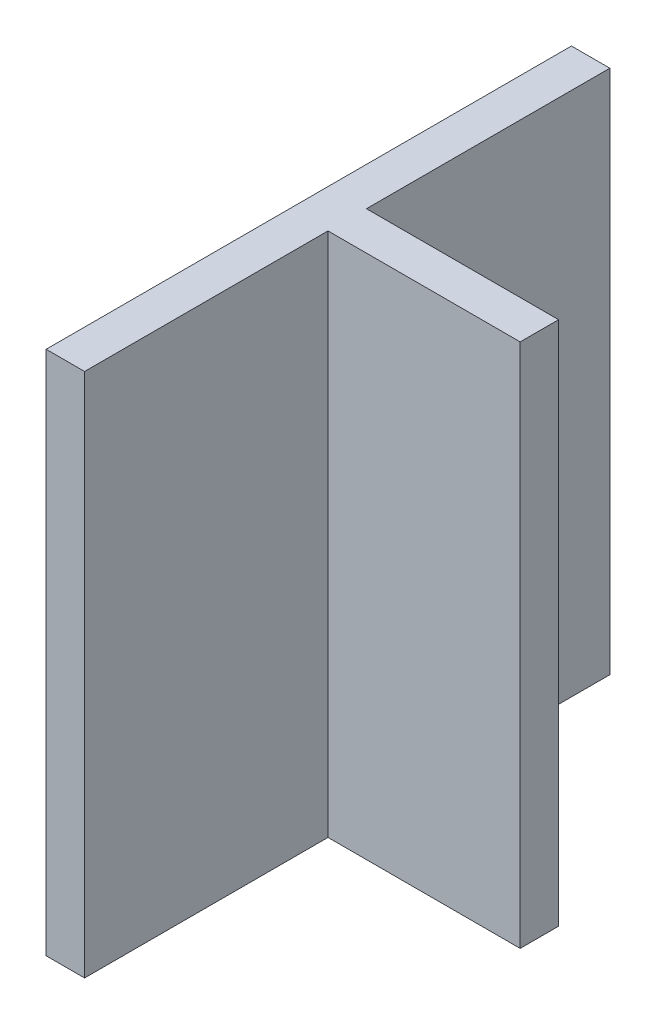
ISO-10303-21;
HEADER;
FILE_DESCRIPTION(('STEP AP214'),'2;1');
FILE_NAME('part.step','',(''),(''),'','','');
FILE_SCHEMA(('AUTOMOTIVE_DESIGN { 1 0 10303 214 1 1 1 1 }'));
ENDSEC;
DATA;
#1=APPLICATION_CONTEXT('core data for automotive mechanical design processes');
#2=APPLICATION_PROTOCOL_DEFINITION('international standard','automotive_design',2000,#1);
#3=PRODUCT_CONTEXT('',#1,'mechanical');
#4=PRODUCT('Part','Part','',(#3));
#5=PRODUCT_RELATED_PRODUCT_CATEGORY('part','',(#4));
#6=PRODUCT_DEFINITION_FORMATION('','',#4);
#7=PRODUCT_DEFINITION_CONTEXT('part definition',#1,'design');
#8=PRODUCT_DEFINITION('design','',#6,#7);
#9=PRODUCT_DEFINITION_SHAPE('','',#8);
#10=(LENGTH_UNIT() NAMED_UNIT(*) SI_UNIT(.MILLI.,.METRE.));
#11=(NAMED_UNIT(*) PLANE_ANGLE_UNIT() SI_UNIT($,.RADIAN.));
#12=(NAMED_UNIT(*) SI_UNIT($,.STERADIAN.) SOLID_ANGLE_UNIT());
#13=UNCERTAINTY_MEASURE_WITH_UNIT(LENGTH_MEASURE(1.E-05),#10,'distance_accuracy_value','');
#14=(GEOMETRIC_REPRESENTATION_CONTEXT(3) GLOBAL_UNCERTAINTY_ASSIGNED_CONTEXT((#13)) GLOBAL_UNIT_ASSIGNED_CONTEXT((#10,
#11,#12)) REPRESENTATION_CONTEXT('',''));
#15=CARTESIAN_POINT('',(0.,0.,0.));
#16=DIRECTION('',(0.,0.,1.));
#17=DIRECTION('',(1.,0.,0.));
#18=AXIS2_PLACEMENT_3D('',#15,#16,#17);
#19=CARTESIAN_POINT('',(0.,41.,-20.5));
#20=DIRECTION('',(1.,0.,0.));
#21=DIRECTION('',(0.,0.,-1.));
#22=AXIS2_PLACEMENT_3D('',#19,#20,#21);
#23=PLANE('',#22);
#24=DIRECTION('',(0.,0.,1.));
#25=VECTOR('',#24,1.);
#26=CARTESIAN_POINT('',(0.,0.,-20.5));
#27=LINE('',#26,#25);
#28=CARTESIAN_POINT('',(0.,0.,-20.5));
#29=VERTEX_POINT('',#28);
#30=CARTESIAN_POINT('',(0.,0.,20.5));
#31=VERTEX_POINT('',#30);
#32=EDGE_CURVE('E140',#29,#31,#27,.T.);
#33=ORIENTED_EDGE('',*,*,#32,.T.);
#34=DIRECTION('',(0.,-1.,0.));
#35=VECTOR('',#34,1.);
#36=CARTESIAN_POINT('',(0.,41.,20.5));
#37=LINE('',#36,#35);
#38=CARTESIAN_POINT('',(0.,41.,20.5));
#39=VERTEX_POINT('',#38);
#40=EDGE_CURVE('E11',#39,#31,#37,.T.);
#41=ORIENTED_EDGE('',*,*,#40,.F.);
#42=DIRECTION('',(0.,0.,1.));
#43=VECTOR('',#42,1.);
#44=CARTESIAN_POINT('',(0.,41.,-20.5));
#45=LINE('',#44,#43);
#46=CARTESIAN_POINT('',(0.,41.,-20.5));
#47=VERTEX_POINT('',#46);
#48=EDGE_CURVE('E162',#47,#39,#45,.T.);
#49=ORIENTED_EDGE('',*,*,#48,.F.);
#50=DIRECTION('',(0.,-1.,0.));
#51=VECTOR('',#50,1.);
#52=CARTESIAN_POINT('',(0.,41.,-20.5));
#53=LINE('',#52,#51);
#54=EDGE_CURVE('E136',#47,#29,#53,.T.);
#55=ORIENTED_EDGE('',*,*,#54,.T.);
#56=EDGE_LOOP('',(#33,#41,#49,#55));
#57=FACE_BOUND('',#56,.T.);
#58=ADVANCED_FACE('F39',(#57),#23,.F.);
#59=CARTESIAN_POINT('',(3.,41.,20.5));
#60=DIRECTION('',(0.,0.,-1.));
#61=DIRECTION('',(-1.,0.,0.));
#62=AXIS2_PLACEMENT_3D('',#59,#60,#61);
#63=PLANE('',#62);
#64=DIRECTION('',(1.,0.,0.));
#65=VECTOR('',#64,1.);
#66=CARTESIAN_POINT('',(3.,0.,20.5));
#67=LINE('',#66,#65);
#68=CARTESIAN_POINT('',(3.,0.,20.5));
#69=VERTEX_POINT('',#68);
#70=EDGE_CURVE('E144',#31,#69,#67,.T.);
#71=ORIENTED_EDGE('',*,*,#70,.T.);
#72=DIRECTION('',(0.,-1.,0.));
#73=VECTOR('',#72,1.);
#74=CARTESIAN_POINT('',(3.,41.,20.5));
#75=LINE('',#74,#73);
#76=CARTESIAN_POINT('',(3.,41.,20.5));
#77=VERTEX_POINT('',#76);
#78=EDGE_CURVE('E48',#77,#69,#75,.T.);
#79=ORIENTED_EDGE('',*,*,#78,.F.);
#80=DIRECTION('',(1.,0.,0.));
#81=VECTOR('',#80,1.);
#82=CARTESIAN_POINT('',(3.,41.,20.5));
#83=LINE('',#82,#81);
#84=EDGE_CURVE('E99',#39,#77,#83,.T.);
#85=ORIENTED_EDGE('',*,*,#84,.F.);
#86=ORIENTED_EDGE('',*,*,#40,.T.);
#87=EDGE_LOOP('',(#71,#79,#85,#86));
#88=FACE_BOUND('',#87,.T.);
#89=ADVANCED_FACE('F208',(#88),#63,.F.);
#90=CARTESIAN_POINT('',(3.,41.,1.5));
#91=DIRECTION('',(-1.,0.,0.));
#92=DIRECTION('',(0.,0.,1.));
#93=AXIS2_PLACEMENT_3D('',#90,#91,#92);
#94=PLANE('',#93);
#95=DIRECTION('',(0.,0.,-1.));
#96=VECTOR('',#95,1.);
#97=CARTESIAN_POINT('',(3.,0.,1.5));
#98=LINE('',#97,#96);
#99=CARTESIAN_POINT('',(3.,0.,1.5));
#100=VERTEX_POINT('',#99);
#101=EDGE_CURVE('E147',#69,#100,#98,.T.);
#102=ORIENTED_EDGE('',*,*,#101,.T.);
#103=DIRECTION('',(0.,-1.,0.));
#104=VECTOR('',#103,1.);
#105=CARTESIAN_POINT('',(3.,41.,1.5));
#106=LINE('',#105,#104);
#107=CARTESIAN_POINT('',(3.,41.,1.5));
#108=VERTEX_POINT('',#107);
#109=EDGE_CURVE('E173',#108,#100,#106,.T.);
#110=ORIENTED_EDGE('',*,*,#109,.F.);
#111=DIRECTION('',(0.,0.,-1.));
#112=VECTOR('',#111,1.);
#113=CARTESIAN_POINT('',(3.,41.,1.5));
#114=LINE('',#113,#112);
#115=EDGE_CURVE('E183',#77,#108,#114,.T.);
#116=ORIENTED_EDGE('',*,*,#115,.F.);
#117=ORIENTED_EDGE('',*,*,#78,.T.);
#118=EDGE_LOOP('',(#102,#110,#116,#117));
#119=FACE_BOUND('',#118,.T.);
#120=ADVANCED_FACE('F181',(#119),#94,.F.);
#121=CARTESIAN_POINT('',(18.,41.,1.49999999999999));
#122=DIRECTION('',(0.,0.,-1.));
#123=DIRECTION('',(-1.,0.,0.));
#124=AXIS2_PLACEMENT_3D('',#121,#122,#123);
#125=PLANE('',#124);
#126=DIRECTION('',(1.,0.,0.));
#127=VECTOR('',#126,1.);
#128=CARTESIAN_POINT('',(18.,0.,1.49999999999999));
#129=LINE('',#128,#127);
#130=CARTESIAN_POINT('',(18.,0.,1.49999999999999));
#131=VERTEX_POINT('',#130);
#132=EDGE_CURVE('E150',#100,#131,#129,.T.);
#133=ORIENTED_EDGE('',*,*,#132,.T.);
#134=DIRECTION('',(0.,-1.,0.));
#135=VECTOR('',#134,1.);
#136=CARTESIAN_POINT('',(18.,41.,1.49999999999999));
#137=LINE('',#136,#135);
#138=CARTESIAN_POINT('',(18.,41.,1.49999999999999));
#139=VERTEX_POINT('',#138);
#140=EDGE_CURVE('E169',#139,#131,#137,.T.);
#141=ORIENTED_EDGE('',*,*,#140,.F.);
#142=DIRECTION('',(1.,0.,0.));
#143=VECTOR('',#142,1.);
#144=CARTESIAN_POINT('',(18.,41.,1.49999999999999));
#145=LINE('',#144,#143);
#146=EDGE_CURVE('E196',#108,#139,#145,.T.);
#147=ORIENTED_EDGE('',*,*,#146,.F.);
#148=ORIENTED_EDGE('',*,*,#109,.T.);
#149=EDGE_LOOP('',(#133,#141,#147,#148));
#150=FACE_BOUND('',#149,.T.);
#151=ADVANCED_FACE('F191',(#150),#125,.F.);
#152=CARTESIAN_POINT('',(18.,41.,-1.5));
#153=DIRECTION('',(-1.,0.,0.));
#154=DIRECTION('',(0.,0.,1.));
#155=AXIS2_PLACEMENT_3D('',#152,#153,#154);
#156=PLANE('',#155);
#157=DIRECTION('',(0.,0.,-1.));
#158=VECTOR('',#157,1.);
#159=CARTESIAN_POINT('',(18.,0.,-1.5));
#160=LINE('',#159,#158);
#161=CARTESIAN_POINT('',(18.,0.,-1.5));
#162=VERTEX_POINT('',#161);
#163=EDGE_CURVE('E153',#131,#162,#160,.T.);
#164=ORIENTED_EDGE('',*,*,#163,.T.);
#165=DIRECTION('',(0.,-1.,0.));
#166=VECTOR('',#165,1.);
#167=CARTESIAN_POINT('',(18.,41.,-1.5));
#168=LINE('',#167,#166);
#169=CARTESIAN_POINT('',(18.,41.,-1.5));
#170=VERTEX_POINT('',#169);
#171=EDGE_CURVE('E129',#170,#162,#168,.T.);
#172=ORIENTED_EDGE('',*,*,#171,.F.);
#173=DIRECTION('',(0.,0.,-1.));
#174=VECTOR('',#173,1.);
#175=CARTESIAN_POINT('',(18.,41.,-1.5));
#176=LINE('',#175,#174);
#177=EDGE_CURVE('E118',#139,#170,#176,.T.);
#178=ORIENTED_EDGE('',*,*,#177,.F.);
#179=ORIENTED_EDGE('',*,*,#140,.T.);
#180=EDGE_LOOP('',(#164,#172,#178,#179));
#181=FACE_BOUND('',#180,.T.);
#182=ADVANCED_FACE('F194',(#181),#156,.F.);
#183=CARTESIAN_POINT('',(3.,41.,-1.5));
#184=DIRECTION('',(0.,0.,1.));
#185=DIRECTION('',(1.,0.,0.));
#186=AXIS2_PLACEMENT_3D('',#183,#184,#185);
#187=PLANE('',#186);
#188=DIRECTION('',(-1.,0.,0.));
#189=VECTOR('',#188,1.);
#190=CARTESIAN_POINT('',(3.,0.,-1.5));
#191=LINE('',#190,#189);
#192=CARTESIAN_POINT('',(3.,0.,-1.5));
#193=VERTEX_POINT('',#192);
#194=EDGE_CURVE('E127',#162,#193,#191,.T.);
#195=ORIENTED_EDGE('',*,*,#194,.T.);
#196=DIRECTION('',(0.,-1.,0.));
#197=VECTOR('',#196,1.);
#198=CARTESIAN_POINT('',(3.,41.,-1.5));
#199=LINE('',#198,#197);
#200=CARTESIAN_POINT('',(3.,41.,-1.5));
#201=VERTEX_POINT('',#200);
#202=EDGE_CURVE('E124',#201,#193,#199,.T.);
#203=ORIENTED_EDGE('',*,*,#202,.F.);
#204=DIRECTION('',(-1.,0.,0.));
#205=VECTOR('',#204,1.);
#206=CARTESIAN_POINT('',(3.,41.,-1.5));
#207=LINE('',#206,#205);
#208=EDGE_CURVE('E112',#170,#201,#207,.T.);
#209=ORIENTED_EDGE('',*,*,#208,.F.);
#210=ORIENTED_EDGE('',*,*,#171,.T.);
#211=EDGE_LOOP('',(#195,#203,#209,#210));
#212=FACE_BOUND('',#211,.T.);
#213=ADVANCED_FACE('F125',(#212),#187,.F.);
#214=CARTESIAN_POINT('',(2.99999999999999,41.,-20.5));
#215=DIRECTION('',(-1.,0.,0.));
#216=DIRECTION('',(0.,0.,1.));
#217=AXIS2_PLACEMENT_3D('',#214,#215,#216);
#218=PLANE('',#217);
#219=DIRECTION('',(0.,0.,-1.));
#220=VECTOR('',#219,1.);
#221=CARTESIAN_POINT('',(2.99999999999999,0.,-20.5));
#222=LINE('',#221,#220);
#223=CARTESIAN_POINT('',(2.99999999999999,0.,-20.5));
#224=VERTEX_POINT('',#223);
#225=EDGE_CURVE('E85',#193,#224,#222,.T.);
#226=ORIENTED_EDGE('',*,*,#225,.T.);
#227=DIRECTION('',(0.,-1.,0.));
#228=VECTOR('',#227,1.);
#229=CARTESIAN_POINT('',(2.99999999999999,41.,-20.5));
#230=LINE('',#229,#228);
#231=CARTESIAN_POINT('',(2.99999999999999,41.,-20.5));
#232=VERTEX_POINT('',#231);
#233=EDGE_CURVE('E130',#232,#224,#230,.T.);
#234=ORIENTED_EDGE('',*,*,#233,.F.);
#235=DIRECTION('',(0.,0.,-1.));
#236=VECTOR('',#235,1.);
#237=CARTESIAN_POINT('',(2.99999999999999,41.,-20.5));
#238=LINE('',#237,#236);
#239=EDGE_CURVE('E116',#201,#232,#238,.T.);
#240=ORIENTED_EDGE('',*,*,#239,.F.);
#241=ORIENTED_EDGE('',*,*,#202,.T.);
#242=EDGE_LOOP('',(#226,#234,#240,#241));
#243=FACE_BOUND('',#242,.T.);
#244=ADVANCED_FACE('F132',(#243),#218,.F.);
#245=CARTESIAN_POINT('',(0.,41.,-20.5));
#246=DIRECTION('',(0.,0.,1.));
#247=DIRECTION('',(1.,0.,0.));
#248=AXIS2_PLACEMENT_3D('',#245,#246,#247);
#249=PLANE('',#248);
#250=DIRECTION('',(-1.,0.,0.));
#251=VECTOR('',#250,1.);
#252=CARTESIAN_POINT('',(0.,0.,-20.5));
#253=LINE('',#252,#251);
#254=EDGE_CURVE('E91',#224,#29,#253,.T.);
#255=ORIENTED_EDGE('',*,*,#254,.T.);
#256=ORIENTED_EDGE('',*,*,#54,.F.);
#257=DIRECTION('',(-1.,0.,0.));
#258=VECTOR('',#257,1.);
#259=CARTESIAN_POINT('',(0.,41.,-20.5));
#260=LINE('',#259,#258);
#261=EDGE_CURVE('E56',#232,#47,#260,.T.);
#262=ORIENTED_EDGE('',*,*,#261,.F.);
#263=ORIENTED_EDGE('',*,*,#233,.T.);
#264=EDGE_LOOP('',(#255,#256,#262,#263));
#265=FACE_BOUND('',#264,.T.);
#266=ADVANCED_FACE('F224',(#265),#249,.F.);
#267=CARTESIAN_POINT('',(0.,41.,0.));
#268=DIRECTION('',(0.,-1.,0.));
#269=DIRECTION('',(0.,0.,-1.));
#270=AXIS2_PLACEMENT_3D('',#267,#268,#269);
#271=PLANE('',#270);
#272=ORIENTED_EDGE('',*,*,#48,.T.);
#273=ORIENTED_EDGE('',*,*,#84,.T.);
#274=ORIENTED_EDGE('',*,*,#115,.T.);
#275=ORIENTED_EDGE('',*,*,#146,.T.);
#276=ORIENTED_EDGE('',*,*,#177,.T.);
#277=ORIENTED_EDGE('',*,*,#208,.T.);
#278=ORIENTED_EDGE('',*,*,#239,.T.);
#279=ORIENTED_EDGE('',*,*,#261,.T.);
#280=EDGE_LOOP('',(#272,#273,#274,#275,#276,#277,#278,#279));
#281=FACE_BOUND('',#280,.T.);
#282=ADVANCED_FACE('F114',(#281),#271,.F.);
#283=CARTESIAN_POINT('',(0.,0.,0.));
#284=DIRECTION('',(0.,-1.,0.));
#285=DIRECTION('',(0.,0.,-1.));
#286=AXIS2_PLACEMENT_3D('',#283,#284,#285);
#287=PLANE('',#286);
#288=ORIENTED_EDGE('',*,*,#32,.F.);
#289=ORIENTED_EDGE('',*,*,#254,.F.);
#290=ORIENTED_EDGE('',*,*,#225,.F.);
#291=ORIENTED_EDGE('',*,*,#194,.F.);
#292=ORIENTED_EDGE('',*,*,#163,.F.);
#293=ORIENTED_EDGE('',*,*,#132,.F.);
#294=ORIENTED_EDGE('',*,*,#101,.F.);
#295=ORIENTED_EDGE('',*,*,#70,.F.);
#296=EDGE_LOOP('',(#288,#289,#290,#291,#292,#293,#294,#295));
#297=FACE_BOUND('',#296,.T.);
#298=ADVANCED_FACE('F187',(#297),#287,.T.);
#299=CLOSED_SHELL('',(#58,#89,#120,#151,#182,#213,#244,#266,#282,#298));
#300=MANIFOLD_SOLID_BREP('B2',#299);
#301=ADVANCED_BREP_SHAPE_REPRESENTATION('',(#18,#300),#14);
#302=SHAPE_DEFINITION_REPRESENTATION(#9,#301);
ENDSEC;
END-ISO-10303-21;
